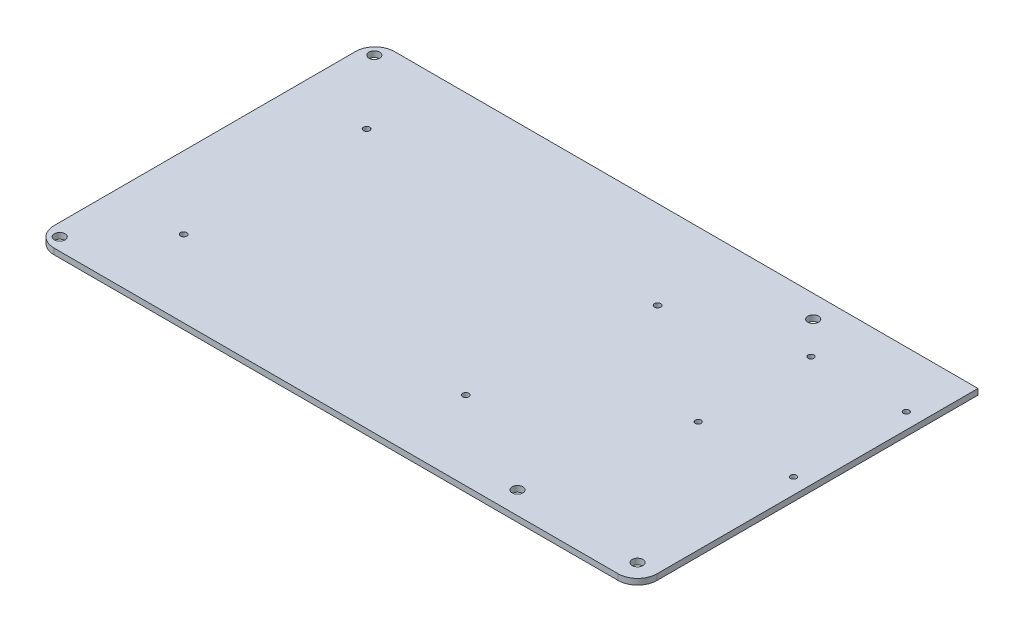
ISO-10303-21;
HEADER;
FILE_DESCRIPTION(('STEP AP214'),'2;1');
FILE_NAME('part.step','',(''),(''),'','','');
FILE_SCHEMA(('AUTOMOTIVE_DESIGN { 1 0 10303 214 1 1 1 1 }'));
ENDSEC;
DATA;
#1=APPLICATION_CONTEXT('core data for automotive mechanical design processes');
#2=APPLICATION_PROTOCOL_DEFINITION('international standard','automotive_design',2000,#1);
#3=PRODUCT_CONTEXT('',#1,'mechanical');
#4=PRODUCT('Part','Part','',(#3));
#5=PRODUCT_RELATED_PRODUCT_CATEGORY('part','',(#4));
#6=PRODUCT_DEFINITION_FORMATION('','',#4);
#7=PRODUCT_DEFINITION_CONTEXT('part definition',#1,'design');
#8=PRODUCT_DEFINITION('design','',#6,#7);
#9=PRODUCT_DEFINITION_SHAPE('','',#8);
#10=(LENGTH_UNIT() NAMED_UNIT(*) SI_UNIT(.MILLI.,.METRE.));
#11=(NAMED_UNIT(*) PLANE_ANGLE_UNIT() SI_UNIT($,.RADIAN.));
#12=(NAMED_UNIT(*) SI_UNIT($,.STERADIAN.) SOLID_ANGLE_UNIT());
#13=UNCERTAINTY_MEASURE_WITH_UNIT(LENGTH_MEASURE(1.E-05),#10,'distance_accuracy_value','');
#14=(GEOMETRIC_REPRESENTATION_CONTEXT(3) GLOBAL_UNCERTAINTY_ASSIGNED_CONTEXT((#13)) GLOBAL_UNIT_ASSIGNED_CONTEXT((#10,
#11,#12)) REPRESENTATION_CONTEXT('',''));
#15=CARTESIAN_POINT('',(0.,0.,0.));
#16=DIRECTION('',(0.,0.,1.));
#17=DIRECTION('',(1.,0.,0.));
#18=AXIS2_PLACEMENT_3D('',#15,#16,#17);
#19=CARTESIAN_POINT('',(145.,3.,77.5));
#20=DIRECTION('',(0.,-1.,0.));
#21=DIRECTION('',(0.,0.,-1.));
#22=AXIS2_PLACEMENT_3D('',#19,#20,#21);
#23=PLANE('',#22);
#24=CARTESIAN_POINT('',(-117.697345367202,3.,-45.8964243223789));
#25=DIRECTION('',(0.,1.,0.));
#26=DIRECTION('',(0.,0.,1.));
#27=AXIS2_PLACEMENT_3D('',#24,#25,#26);
#28=CIRCLE('',#27,1.60000000000001);
#29=CARTESIAN_POINT('',(-117.697345367202,3.,-44.2964243223789));
#30=VERTEX_POINT('',#29);
#31=EDGE_CURVE('E170',#30,#30,#28,.T.);
#32=ORIENTED_EDGE('',*,*,#31,.F.);
#33=EDGE_LOOP('',(#32));
#34=FACE_BOUND('',#33,.T.);
#35=CARTESIAN_POINT('',(35.6685077427976,3.,-42.1419603965456));
#36=DIRECTION('',(0.,1.,0.));
#37=DIRECTION('',(0.,0.,1.));
#38=AXIS2_PLACEMENT_3D('',#35,#36,#37);
#39=CIRCLE('',#38,1.60000000000001);
#40=CARTESIAN_POINT('',(35.6685077427976,3.,-40.5419603965456));
#41=VERTEX_POINT('',#40);
#42=EDGE_CURVE('E328',#41,#41,#39,.T.);
#43=ORIENTED_EDGE('',*,*,#42,.F.);
#44=EDGE_LOOP('',(#43));
#45=FACE_BOUND('',#44,.T.);
#46=CARTESIAN_POINT('',(26.2756564719289,3.,47.1235410340986));
#47=DIRECTION('',(0.,1.,0.));
#48=DIRECTION('',(0.,0.,1.));
#49=AXIS2_PLACEMENT_3D('',#46,#47,#48);
#50=CIRCLE('',#49,1.6);
#51=CARTESIAN_POINT('',(26.2756564719289,3.,48.7235410340985));
#52=VERTEX_POINT('',#51);
#53=EDGE_CURVE('E331',#52,#52,#50,.T.);
#54=ORIENTED_EDGE('',*,*,#53,.F.);
#55=EDGE_LOOP('',(#54));
#56=FACE_BOUND('',#55,.T.);
#57=CARTESIAN_POINT('',(-117.787345368071,3.,48.0535756746172));
#58=DIRECTION('',(0.,1.,0.));
#59=DIRECTION('',(0.,0.,1.));
#60=AXIS2_PLACEMENT_3D('',#57,#58,#59);
#61=CIRCLE('',#60,1.60000000000001);
#62=CARTESIAN_POINT('',(-117.787345368071,3.,49.6535756746172));
#63=VERTEX_POINT('',#62);
#64=EDGE_CURVE('E335',#63,#63,#61,.T.);
#65=ORIENTED_EDGE('',*,*,#64,.F.);
#66=EDGE_LOOP('',(#65));
#67=FACE_BOUND('',#66,.T.);
#68=DIRECTION('',(0.,0.,-1.));
#69=VECTOR('',#68,1.);
#70=CARTESIAN_POINT('',(155.,3.,-87.5000000000001));
#71=LINE('',#70,#69);
#72=CARTESIAN_POINT('',(155.,3.,77.5));
#73=VERTEX_POINT('',#72);
#74=CARTESIAN_POINT('',(155.,3.,-87.5000000000001));
#75=VERTEX_POINT('',#74);
#76=EDGE_CURVE('E156',#73,#75,#71,.T.);
#77=ORIENTED_EDGE('',*,*,#76,.T.);
#78=DIRECTION('',(-1.,0.,0.));
#79=VECTOR('',#78,1.);
#80=CARTESIAN_POINT('',(-145.,3.,-87.5));
#81=LINE('',#80,#79);
#82=CARTESIAN_POINT('',(-145.,3.,-87.5));
#83=VERTEX_POINT('',#82);
#84=EDGE_CURVE('E101',#75,#83,#81,.T.);
#85=ORIENTED_EDGE('',*,*,#84,.T.);
#86=CARTESIAN_POINT('',(-145.,3.,-77.4999999999999));
#87=DIRECTION('',(0.,1.,0.));
#88=DIRECTION('',(0.,0.,-1.));
#89=AXIS2_PLACEMENT_3D('',#86,#87,#88);
#90=CIRCLE('',#89,10.);
#91=CARTESIAN_POINT('',(-155.,3.,-77.4999999999999));
#92=VERTEX_POINT('',#91);
#93=EDGE_CURVE('E240',#83,#92,#90,.T.);
#94=ORIENTED_EDGE('',*,*,#93,.T.);
#95=DIRECTION('',(0.,0.,1.));
#96=VECTOR('',#95,1.);
#97=CARTESIAN_POINT('',(-155.,3.,-77.4999999999999));
#98=LINE('',#97,#96);
#99=CARTESIAN_POINT('',(-155.,3.,77.5));
#100=VERTEX_POINT('',#99);
#101=EDGE_CURVE('E118',#92,#100,#98,.T.);
#102=ORIENTED_EDGE('',*,*,#101,.T.);
#103=CARTESIAN_POINT('',(-145.,3.,77.5));
#104=DIRECTION('',(0.,1.,0.));
#105=DIRECTION('',(0.,0.,1.));
#106=AXIS2_PLACEMENT_3D('',#103,#104,#105);
#107=CIRCLE('',#106,10.);
#108=CARTESIAN_POINT('',(-145.,3.,87.5));
#109=VERTEX_POINT('',#108);
#110=EDGE_CURVE('E112',#100,#109,#107,.T.);
#111=ORIENTED_EDGE('',*,*,#110,.T.);
#112=DIRECTION('',(1.,0.,0.));
#113=VECTOR('',#112,1.);
#114=CARTESIAN_POINT('',(145.,3.,87.5));
#115=LINE('',#114,#113);
#116=CARTESIAN_POINT('',(145.,3.,87.5));
#117=VERTEX_POINT('',#116);
#118=EDGE_CURVE('E116',#109,#117,#115,.T.);
#119=ORIENTED_EDGE('',*,*,#118,.T.);
#120=CARTESIAN_POINT('',(145.,3.,77.5));
#121=DIRECTION('',(0.,1.,0.));
#122=DIRECTION('',(0.,0.,-1.));
#123=AXIS2_PLACEMENT_3D('',#120,#121,#122);
#124=CIRCLE('',#123,10.);
#125=EDGE_CURVE('E59',#117,#73,#124,.T.);
#126=ORIENTED_EDGE('',*,*,#125,.T.);
#127=EDGE_LOOP('',(#77,#85,#94,#102,#111,#119,#126));
#128=FACE_BOUND('',#127,.T.);
#129=CARTESIAN_POINT('',(-148.535533905905,3.,-80.692777162614));
#130=DIRECTION('',(0.,1.,0.));
#131=DIRECTION('',(0.,0.,1.));
#132=AXIS2_PLACEMENT_3D('',#129,#130,#131);
#133=CIRCLE('',#132,2.75000000000001);
#134=CARTESIAN_POINT('',(-148.535533905905,3.,-77.942777162614));
#135=VERTEX_POINT('',#134);
#136=EDGE_CURVE('E145',#135,#135,#133,.T.);
#137=ORIENTED_EDGE('',*,*,#136,.F.);
#138=EDGE_LOOP('',(#137));
#139=FACE_BOUND('',#138,.T.);
#140=CARTESIAN_POINT('',(-148.535533905905,3.,81.0355339059049));
#141=DIRECTION('',(0.,1.,0.));
#142=DIRECTION('',(0.,0.,1.));
#143=AXIS2_PLACEMENT_3D('',#140,#141,#142);
#144=CIRCLE('',#143,2.75000000000001);
#145=CARTESIAN_POINT('',(-148.535533905905,3.,83.7855339059049));
#146=VERTEX_POINT('',#145);
#147=EDGE_CURVE('E226',#146,#146,#144,.T.);
#148=ORIENTED_EDGE('',*,*,#147,.F.);
#149=EDGE_LOOP('',(#148));
#150=FACE_BOUND('',#149,.T.);
#151=CARTESIAN_POINT('',(97.9209453158937,3.,-58.7287511768892));
#152=DIRECTION('',(0.,1.,0.));
#153=DIRECTION('',(0.,0.,1.));
#154=AXIS2_PLACEMENT_3D('',#151,#152,#153);
#155=CIRCLE('',#154,1.5);
#156=CARTESIAN_POINT('',(97.9209453158937,3.,-57.2287511768893));
#157=VERTEX_POINT('',#156);
#158=EDGE_CURVE('E220',#157,#157,#155,.T.);
#159=ORIENTED_EDGE('',*,*,#158,.F.);
#160=EDGE_LOOP('',(#159));
#161=FACE_BOUND('',#160,.T.);
#162=CARTESIAN_POINT('',(146.920945315894,3.,-58.7287511768893));
#163=DIRECTION('',(0.,1.,0.));
#164=DIRECTION('',(0.,0.,1.));
#165=AXIS2_PLACEMENT_3D('',#162,#163,#164);
#166=CIRCLE('',#165,1.5);
#167=CARTESIAN_POINT('',(146.920945315894,3.,-57.2287511768893));
#168=VERTEX_POINT('',#167);
#169=EDGE_CURVE('E214',#168,#168,#166,.T.);
#170=ORIENTED_EDGE('',*,*,#169,.F.);
#171=EDGE_LOOP('',(#170));
#172=FACE_BOUND('',#171,.T.);
#173=CARTESIAN_POINT('',(81.7862434103394,3.,-75.9999999999998));
#174=DIRECTION('',(0.,1.,0.));
#175=DIRECTION('',(0.,0.,1.));
#176=AXIS2_PLACEMENT_3D('',#173,#174,#175);
#177=CIRCLE('',#176,2.75000000000981);
#178=CARTESIAN_POINT('',(81.7862434103394,3.,-73.24999999999));
#179=VERTEX_POINT('',#178);
#180=EDGE_CURVE('E208',#179,#179,#177,.T.);
#181=ORIENTED_EDGE('',*,*,#180,.F.);
#182=EDGE_LOOP('',(#181));
#183=FACE_BOUND('',#182,.T.);
#184=CARTESIAN_POINT('',(97.9209453158937,3.,-0.728751176889254));
#185=DIRECTION('',(0.,1.,0.));
#186=DIRECTION('',(0.,0.,1.));
#187=AXIS2_PLACEMENT_3D('',#184,#185,#186);
#188=CIRCLE('',#187,1.5);
#189=CARTESIAN_POINT('',(97.9209453158937,3.,0.771248823110743));
#190=VERTEX_POINT('',#189);
#191=EDGE_CURVE('E202',#190,#190,#188,.T.);
#192=ORIENTED_EDGE('',*,*,#191,.F.);
#193=EDGE_LOOP('',(#192));
#194=FACE_BOUND('',#193,.T.);
#195=CARTESIAN_POINT('',(146.920945315894,3.,-0.72875117688926));
#196=DIRECTION('',(0.,1.,0.));
#197=DIRECTION('',(0.,0.,1.));
#198=AXIS2_PLACEMENT_3D('',#195,#196,#197);
#199=CIRCLE('',#198,1.5);
#200=CARTESIAN_POINT('',(146.920945315894,3.,0.771248823110737));
#201=VERTEX_POINT('',#200);
#202=EDGE_CURVE('E196',#201,#201,#199,.T.);
#203=ORIENTED_EDGE('',*,*,#202,.F.);
#204=EDGE_LOOP('',(#203));
#205=FACE_BOUND('',#204,.T.);
#206=CARTESIAN_POINT('',(81.7862434103392,3.,76.));
#207=DIRECTION('',(0.,1.,0.));
#208=DIRECTION('',(0.,0.,1.));
#209=AXIS2_PLACEMENT_3D('',#206,#207,#208);
#210=CIRCLE('',#209,2.74999999999605);
#211=CARTESIAN_POINT('',(81.7862434103392,3.,78.7499999999961));
#212=VERTEX_POINT('',#211);
#213=EDGE_CURVE('E190',#212,#212,#210,.T.);
#214=ORIENTED_EDGE('',*,*,#213,.F.);
#215=EDGE_LOOP('',(#214));
#216=FACE_BOUND('',#215,.T.);
#217=CARTESIAN_POINT('',(145.,3.,77.5));
#218=DIRECTION('',(0.,1.,0.));
#219=DIRECTION('',(0.,0.,1.));
#220=AXIS2_PLACEMENT_3D('',#217,#218,#219);
#221=CIRCLE('',#220,2.75000000000001);
#222=CARTESIAN_POINT('',(145.,3.,80.25));
#223=VERTEX_POINT('',#222);
#224=EDGE_CURVE('E181',#223,#223,#221,.T.);
#225=ORIENTED_EDGE('',*,*,#224,.F.);
#226=EDGE_LOOP('',(#225));
#227=FACE_BOUND('',#226,.T.);
#228=ADVANCED_FACE('F40',(#34,#45,#56,#67,#128,#139,#150,#161,#172,#183,#194,#205,#216,#227),
#23,.F.);
#229=CARTESIAN_POINT('',(145.,0.,77.5));
#230=DIRECTION('',(0.,-1.,0.));
#231=DIRECTION('',(0.,0.,-1.));
#232=AXIS2_PLACEMENT_3D('',#229,#230,#231);
#233=PLANE('',#232);
#234=CARTESIAN_POINT('',(-117.697345367202,0.,-45.8964243223789));
#235=DIRECTION('',(0.,-1.,0.));
#236=DIRECTION('',(0.,0.,-1.));
#237=AXIS2_PLACEMENT_3D('',#234,#235,#236);
#238=CIRCLE('',#237,1.60000000000001);
#239=CARTESIAN_POINT('',(-117.697345367202,0.,-47.4964243223789));
#240=VERTEX_POINT('',#239);
#241=EDGE_CURVE('E44',#240,#240,#238,.T.);
#242=ORIENTED_EDGE('',*,*,#241,.F.);
#243=EDGE_LOOP('',(#242));
#244=FACE_BOUND('',#243,.T.);
#245=CARTESIAN_POINT('',(35.6685077427976,0.,-42.1419603965456));
#246=DIRECTION('',(0.,-1.,0.));
#247=DIRECTION('',(0.,0.,-1.));
#248=AXIS2_PLACEMENT_3D('',#245,#246,#247);
#249=CIRCLE('',#248,1.60000000000001);
#250=CARTESIAN_POINT('',(35.6685077427976,0.,-43.7419603965457));
#251=VERTEX_POINT('',#250);
#252=EDGE_CURVE('E172',#251,#251,#249,.T.);
#253=ORIENTED_EDGE('',*,*,#252,.F.);
#254=EDGE_LOOP('',(#253));
#255=FACE_BOUND('',#254,.T.);
#256=CARTESIAN_POINT('',(26.2756564719289,0.,47.1235410340986));
#257=DIRECTION('',(0.,-1.,0.));
#258=DIRECTION('',(0.,0.,-1.));
#259=AXIS2_PLACEMENT_3D('',#256,#257,#258);
#260=CIRCLE('',#259,1.6);
#261=CARTESIAN_POINT('',(26.2756564719289,0.,45.5235410340985));
#262=VERTEX_POINT('',#261);
#263=EDGE_CURVE('E169',#262,#262,#260,.T.);
#264=ORIENTED_EDGE('',*,*,#263,.F.);
#265=EDGE_LOOP('',(#264));
#266=FACE_BOUND('',#265,.T.);
#267=CARTESIAN_POINT('',(-117.787345368071,0.,48.0535756746172));
#268=DIRECTION('',(0.,-1.,0.));
#269=DIRECTION('',(0.,0.,-1.));
#270=AXIS2_PLACEMENT_3D('',#267,#268,#269);
#271=CIRCLE('',#270,1.60000000000001);
#272=CARTESIAN_POINT('',(-117.787345368071,0.,46.4535756746172));
#273=VERTEX_POINT('',#272);
#274=EDGE_CURVE('E166',#273,#273,#271,.T.);
#275=ORIENTED_EDGE('',*,*,#274,.F.);
#276=EDGE_LOOP('',(#275));
#277=FACE_BOUND('',#276,.T.);
#278=CARTESIAN_POINT('',(81.7862434103392,0.,76.));
#279=DIRECTION('',(0.,1.,0.));
#280=DIRECTION('',(0.,0.,1.));
#281=AXIS2_PLACEMENT_3D('',#278,#279,#280);
#282=CIRCLE('',#281,2.74999999999605);
#283=CARTESIAN_POINT('',(81.7862434103392,0.,78.7499999999961));
#284=VERTEX_POINT('',#283);
#285=EDGE_CURVE('E186',#284,#284,#282,.T.);
#286=ORIENTED_EDGE('',*,*,#285,.T.);
#287=EDGE_LOOP('',(#286));
#288=FACE_BOUND('',#287,.T.);
#289=CARTESIAN_POINT('',(97.9209453158937,0.,-0.728751176889254));
#290=DIRECTION('',(0.,1.,0.));
#291=DIRECTION('',(0.,0.,1.));
#292=AXIS2_PLACEMENT_3D('',#289,#290,#291);
#293=CIRCLE('',#292,1.5);
#294=CARTESIAN_POINT('',(97.9209453158937,0.,0.771248823110743));
#295=VERTEX_POINT('',#294);
#296=EDGE_CURVE('E199',#295,#295,#293,.T.);
#297=ORIENTED_EDGE('',*,*,#296,.T.);
#298=EDGE_LOOP('',(#297));
#299=FACE_BOUND('',#298,.T.);
#300=CARTESIAN_POINT('',(146.920945315894,0.,-58.7287511768893));
#301=DIRECTION('',(0.,1.,0.));
#302=DIRECTION('',(0.,0.,1.));
#303=AXIS2_PLACEMENT_3D('',#300,#301,#302);
#304=CIRCLE('',#303,1.5);
#305=CARTESIAN_POINT('',(146.920945315894,0.,-57.2287511768893));
#306=VERTEX_POINT('',#305);
#307=EDGE_CURVE('E211',#306,#306,#304,.T.);
#308=ORIENTED_EDGE('',*,*,#307,.T.);
#309=EDGE_LOOP('',(#308));
#310=FACE_BOUND('',#309,.T.);
#311=CARTESIAN_POINT('',(-148.535533905905,0.,81.0355339059049));
#312=DIRECTION('',(0.,1.,0.));
#313=DIRECTION('',(0.,0.,1.));
#314=AXIS2_PLACEMENT_3D('',#311,#312,#313);
#315=CIRCLE('',#314,2.75000000000001);
#316=CARTESIAN_POINT('',(-148.535533905905,0.,83.7855339059049));
#317=VERTEX_POINT('',#316);
#318=EDGE_CURVE('E223',#317,#317,#315,.T.);
#319=ORIENTED_EDGE('',*,*,#318,.T.);
#320=EDGE_LOOP('',(#319));
#321=FACE_BOUND('',#320,.T.);
#322=DIRECTION('',(0.,0.,-1.));
#323=VECTOR('',#322,1.);
#324=CARTESIAN_POINT('',(155.,0.,-87.5000000000001));
#325=LINE('',#324,#323);
#326=CARTESIAN_POINT('',(155.,0.,77.5));
#327=VERTEX_POINT('',#326);
#328=CARTESIAN_POINT('',(155.,0.,-87.5000000000001));
#329=VERTEX_POINT('',#328);
#330=EDGE_CURVE('E141',#327,#329,#325,.T.);
#331=ORIENTED_EDGE('',*,*,#330,.F.);
#332=CARTESIAN_POINT('',(145.,0.,77.5));
#333=DIRECTION('',(0.,1.,0.));
#334=DIRECTION('',(0.,0.,-1.));
#335=AXIS2_PLACEMENT_3D('',#332,#333,#334);
#336=CIRCLE('',#335,10.);
#337=CARTESIAN_POINT('',(145.,0.,87.5));
#338=VERTEX_POINT('',#337);
#339=EDGE_CURVE('E93',#338,#327,#336,.T.);
#340=ORIENTED_EDGE('',*,*,#339,.F.);
#341=DIRECTION('',(1.,0.,0.));
#342=VECTOR('',#341,1.);
#343=CARTESIAN_POINT('',(145.,0.,87.5));
#344=LINE('',#343,#342);
#345=CARTESIAN_POINT('',(-145.,0.,87.5));
#346=VERTEX_POINT('',#345);
#347=EDGE_CURVE('E87',#346,#338,#344,.T.);
#348=ORIENTED_EDGE('',*,*,#347,.F.);
#349=CARTESIAN_POINT('',(-145.,0.,77.5));
#350=DIRECTION('',(0.,1.,0.));
#351=DIRECTION('',(0.,0.,1.));
#352=AXIS2_PLACEMENT_3D('',#349,#350,#351);
#353=CIRCLE('',#352,10.);
#354=CARTESIAN_POINT('',(-155.,0.,77.5));
#355=VERTEX_POINT('',#354);
#356=EDGE_CURVE('E127',#355,#346,#353,.T.);
#357=ORIENTED_EDGE('',*,*,#356,.F.);
#358=DIRECTION('',(0.,0.,1.));
#359=VECTOR('',#358,1.);
#360=CARTESIAN_POINT('',(-155.,0.,-77.4999999999999));
#361=LINE('',#360,#359);
#362=CARTESIAN_POINT('',(-155.,0.,-77.4999999999999));
#363=VERTEX_POINT('',#362);
#364=EDGE_CURVE('E149',#363,#355,#361,.T.);
#365=ORIENTED_EDGE('',*,*,#364,.F.);
#366=CARTESIAN_POINT('',(-145.,0.,-77.4999999999999));
#367=DIRECTION('',(0.,1.,0.));
#368=DIRECTION('',(0.,0.,-1.));
#369=AXIS2_PLACEMENT_3D('',#366,#367,#368);
#370=CIRCLE('',#369,10.);
#371=CARTESIAN_POINT('',(-145.,0.,-87.5));
#372=VERTEX_POINT('',#371);
#373=EDGE_CURVE('E147',#372,#363,#370,.T.);
#374=ORIENTED_EDGE('',*,*,#373,.F.);
#375=DIRECTION('',(-1.,0.,0.));
#376=VECTOR('',#375,1.);
#377=CARTESIAN_POINT('',(-145.,0.,-87.5));
#378=LINE('',#377,#376);
#379=EDGE_CURVE('E144',#329,#372,#378,.T.);
#380=ORIENTED_EDGE('',*,*,#379,.F.);
#381=EDGE_LOOP('',(#331,#340,#348,#357,#365,#374,#380));
#382=FACE_BOUND('',#381,.T.);
#383=CARTESIAN_POINT('',(-148.535533905905,0.,-80.692777162614));
#384=DIRECTION('',(0.,1.,0.));
#385=DIRECTION('',(0.,0.,1.));
#386=AXIS2_PLACEMENT_3D('',#383,#384,#385);
#387=CIRCLE('',#386,2.75000000000001);
#388=CARTESIAN_POINT('',(-148.535533905905,0.,-77.942777162614));
#389=VERTEX_POINT('',#388);
#390=EDGE_CURVE('E230',#389,#389,#387,.T.);
#391=ORIENTED_EDGE('',*,*,#390,.T.);
#392=EDGE_LOOP('',(#391));
#393=FACE_BOUND('',#392,.T.);
#394=CARTESIAN_POINT('',(97.9209453158937,0.,-58.7287511768892));
#395=DIRECTION('',(0.,1.,0.));
#396=DIRECTION('',(0.,0.,1.));
#397=AXIS2_PLACEMENT_3D('',#394,#395,#396);
#398=CIRCLE('',#397,1.5);
#399=CARTESIAN_POINT('',(97.9209453158937,0.,-57.2287511768893));
#400=VERTEX_POINT('',#399);
#401=EDGE_CURVE('E217',#400,#400,#398,.T.);
#402=ORIENTED_EDGE('',*,*,#401,.T.);
#403=EDGE_LOOP('',(#402));
#404=FACE_BOUND('',#403,.T.);
#405=CARTESIAN_POINT('',(81.7862434103394,0.,-75.9999999999998));
#406=DIRECTION('',(0.,1.,0.));
#407=DIRECTION('',(0.,0.,1.));
#408=AXIS2_PLACEMENT_3D('',#405,#406,#407);
#409=CIRCLE('',#408,2.75000000000981);
#410=CARTESIAN_POINT('',(81.7862434103394,0.,-73.24999999999));
#411=VERTEX_POINT('',#410);
#412=EDGE_CURVE('E205',#411,#411,#409,.T.);
#413=ORIENTED_EDGE('',*,*,#412,.T.);
#414=EDGE_LOOP('',(#413));
#415=FACE_BOUND('',#414,.T.);
#416=CARTESIAN_POINT('',(146.920945315894,0.,-0.72875117688926));
#417=DIRECTION('',(0.,1.,0.));
#418=DIRECTION('',(0.,0.,1.));
#419=AXIS2_PLACEMENT_3D('',#416,#417,#418);
#420=CIRCLE('',#419,1.5);
#421=CARTESIAN_POINT('',(146.920945315894,0.,0.771248823110737));
#422=VERTEX_POINT('',#421);
#423=EDGE_CURVE('E193',#422,#422,#420,.T.);
#424=ORIENTED_EDGE('',*,*,#423,.T.);
#425=EDGE_LOOP('',(#424));
#426=FACE_BOUND('',#425,.T.);
#427=CARTESIAN_POINT('',(145.,0.,77.5));
#428=DIRECTION('',(0.,1.,0.));
#429=DIRECTION('',(0.,0.,1.));
#430=AXIS2_PLACEMENT_3D('',#427,#428,#429);
#431=CIRCLE('',#430,2.75000000000001);
#432=CARTESIAN_POINT('',(145.,0.,80.25));
#433=VERTEX_POINT('',#432);
#434=EDGE_CURVE('E177',#433,#433,#431,.T.);
#435=ORIENTED_EDGE('',*,*,#434,.T.);
#436=EDGE_LOOP('',(#435));
#437=FACE_BOUND('',#436,.T.);
#438=ADVANCED_FACE('F252',(#244,#255,#266,#277,#288,#299,#310,#321,#382,#393,#404,#415,#426,
#437),#233,.T.);
#439=CARTESIAN_POINT('',(155.,3.,-87.5000000000001));
#440=DIRECTION('',(-1.,0.,0.));
#441=DIRECTION('',(0.,0.,1.));
#442=AXIS2_PLACEMENT_3D('',#439,#440,#441);
#443=PLANE('',#442);
#444=ORIENTED_EDGE('',*,*,#330,.T.);
#445=DIRECTION('',(0.,-1.,0.));
#446=VECTOR('',#445,1.);
#447=CARTESIAN_POINT('',(155.,3.,-87.5000000000001));
#448=LINE('',#447,#446);
#449=EDGE_CURVE('E11',#75,#329,#448,.T.);
#450=ORIENTED_EDGE('',*,*,#449,.F.);
#451=ORIENTED_EDGE('',*,*,#76,.F.);
#452=DIRECTION('',(0.,-1.,0.));
#453=VECTOR('',#452,1.);
#454=CARTESIAN_POINT('',(155.,3.,77.5));
#455=LINE('',#454,#453);
#456=EDGE_CURVE('E137',#73,#327,#455,.T.);
#457=ORIENTED_EDGE('',*,*,#456,.T.);
#458=EDGE_LOOP('',(#444,#450,#451,#457));
#459=FACE_BOUND('',#458,.T.);
#460=ADVANCED_FACE('F42',(#459),#443,.F.);
#461=CARTESIAN_POINT('',(-145.,3.,-87.5));
#462=DIRECTION('',(0.,0.,1.));
#463=DIRECTION('',(1.,0.,0.));
#464=AXIS2_PLACEMENT_3D('',#461,#462,#463);
#465=PLANE('',#464);
#466=ORIENTED_EDGE('',*,*,#379,.T.);
#467=DIRECTION('',(0.,-1.,0.));
#468=VECTOR('',#467,1.);
#469=CARTESIAN_POINT('',(-145.,3.,-87.5));
#470=LINE('',#469,#468);
#471=EDGE_CURVE('E50',#83,#372,#470,.T.);
#472=ORIENTED_EDGE('',*,*,#471,.F.);
#473=ORIENTED_EDGE('',*,*,#84,.F.);
#474=ORIENTED_EDGE('',*,*,#449,.T.);
#475=EDGE_LOOP('',(#466,#472,#473,#474));
#476=FACE_BOUND('',#475,.T.);
#477=ADVANCED_FACE('F431',(#476),#465,.F.);
#478=CARTESIAN_POINT('',(-145.,3.,-77.4999999999999));
#479=DIRECTION('',(0.,-1.,0.));
#480=DIRECTION('',(0.,0.,-1.));
#481=AXIS2_PLACEMENT_3D('',#478,#479,#480);
#482=CYLINDRICAL_SURFACE('',#481,10.);
#483=ORIENTED_EDGE('',*,*,#373,.T.);
#484=DIRECTION('',(0.,-1.,0.));
#485=VECTOR('',#484,1.);
#486=CARTESIAN_POINT('',(-155.,3.,-77.4999999999999));
#487=LINE('',#486,#485);
#488=EDGE_CURVE('E161',#92,#363,#487,.T.);
#489=ORIENTED_EDGE('',*,*,#488,.F.);
#490=ORIENTED_EDGE('',*,*,#93,.F.);
#491=ORIENTED_EDGE('',*,*,#471,.T.);
#492=EDGE_LOOP('',(#483,#489,#490,#491));
#493=FACE_BOUND('',#492,.T.);
#494=ADVANCED_FACE('F245',(#493),#482,.T.);
#495=CARTESIAN_POINT('',(-155.,3.,-77.4999999999999));
#496=DIRECTION('',(1.,0.,0.));
#497=DIRECTION('',(0.,0.,-1.));
#498=AXIS2_PLACEMENT_3D('',#495,#496,#497);
#499=PLANE('',#498);
#500=ORIENTED_EDGE('',*,*,#364,.T.);
#501=DIRECTION('',(0.,-1.,0.));
#502=VECTOR('',#501,1.);
#503=CARTESIAN_POINT('',(-155.,3.,77.5));
#504=LINE('',#503,#502);
#505=EDGE_CURVE('E129',#100,#355,#504,.T.);
#506=ORIENTED_EDGE('',*,*,#505,.F.);
#507=ORIENTED_EDGE('',*,*,#101,.F.);
#508=ORIENTED_EDGE('',*,*,#488,.T.);
#509=EDGE_LOOP('',(#500,#506,#507,#508));
#510=FACE_BOUND('',#509,.T.);
#511=ADVANCED_FACE('F249',(#510),#499,.F.);
#512=CARTESIAN_POINT('',(-145.,3.,77.5));
#513=DIRECTION('',(0.,-1.,0.));
#514=DIRECTION('',(0.,0.,-1.));
#515=AXIS2_PLACEMENT_3D('',#512,#513,#514);
#516=CYLINDRICAL_SURFACE('',#515,10.);
#517=ORIENTED_EDGE('',*,*,#356,.T.);
#518=DIRECTION('',(0.,-1.,0.));
#519=VECTOR('',#518,1.);
#520=CARTESIAN_POINT('',(-145.,3.,87.5));
#521=LINE('',#520,#519);
#522=EDGE_CURVE('E124',#109,#346,#521,.T.);
#523=ORIENTED_EDGE('',*,*,#522,.F.);
#524=ORIENTED_EDGE('',*,*,#110,.F.);
#525=ORIENTED_EDGE('',*,*,#505,.T.);
#526=EDGE_LOOP('',(#517,#523,#524,#525));
#527=FACE_BOUND('',#526,.T.);
#528=ADVANCED_FACE('F125',(#527),#516,.T.);
#529=CARTESIAN_POINT('',(145.,3.,87.5));
#530=DIRECTION('',(0.,0.,-1.));
#531=DIRECTION('',(-1.,0.,0.));
#532=AXIS2_PLACEMENT_3D('',#529,#530,#531);
#533=PLANE('',#532);
#534=ORIENTED_EDGE('',*,*,#347,.T.);
#535=DIRECTION('',(0.,-1.,0.));
#536=VECTOR('',#535,1.);
#537=CARTESIAN_POINT('',(145.,3.,87.5));
#538=LINE('',#537,#536);
#539=EDGE_CURVE('E130',#117,#338,#538,.T.);
#540=ORIENTED_EDGE('',*,*,#539,.F.);
#541=ORIENTED_EDGE('',*,*,#118,.F.);
#542=ORIENTED_EDGE('',*,*,#522,.T.);
#543=EDGE_LOOP('',(#534,#540,#541,#542));
#544=FACE_BOUND('',#543,.T.);
#545=ADVANCED_FACE('F132',(#544),#533,.F.);
#546=CARTESIAN_POINT('',(145.,3.,77.5));
#547=DIRECTION('',(0.,-1.,0.));
#548=DIRECTION('',(0.,0.,-1.));
#549=AXIS2_PLACEMENT_3D('',#546,#547,#548);
#550=CYLINDRICAL_SURFACE('',#549,10.);
#551=ORIENTED_EDGE('',*,*,#339,.T.);
#552=ORIENTED_EDGE('',*,*,#456,.F.);
#553=ORIENTED_EDGE('',*,*,#125,.F.);
#554=ORIENTED_EDGE('',*,*,#539,.T.);
#555=EDGE_LOOP('',(#551,#552,#553,#554));
#556=FACE_BOUND('',#555,.T.);
#557=ADVANCED_FACE('F257',(#556),#550,.T.);
#558=CARTESIAN_POINT('',(-148.535533905905,3.,-80.692777162614));
#559=DIRECTION('',(0.,-1.,0.));
#560=DIRECTION('',(0.,0.,-1.));
#561=AXIS2_PLACEMENT_3D('',#558,#559,#560);
#562=CYLINDRICAL_SURFACE('',#561,2.75000000000001);
#563=ORIENTED_EDGE('',*,*,#136,.T.);
#564=EDGE_LOOP('',(#563));
#565=FACE_BOUND('',#564,.T.);
#566=ORIENTED_EDGE('',*,*,#390,.F.);
#567=EDGE_LOOP('',(#566));
#568=FACE_BOUND('',#567,.T.);
#569=ADVANCED_FACE('F259',(#565,#568),#562,.F.);
#570=CARTESIAN_POINT('',(-148.535533905905,3.,81.0355339059049));
#571=DIRECTION('',(0.,-1.,0.));
#572=DIRECTION('',(0.,0.,-1.));
#573=AXIS2_PLACEMENT_3D('',#570,#571,#572);
#574=CYLINDRICAL_SURFACE('',#573,2.75000000000001);
#575=ORIENTED_EDGE('',*,*,#147,.T.);
#576=EDGE_LOOP('',(#575));
#577=FACE_BOUND('',#576,.T.);
#578=ORIENTED_EDGE('',*,*,#318,.F.);
#579=EDGE_LOOP('',(#578));
#580=FACE_BOUND('',#579,.T.);
#581=ADVANCED_FACE('F265',(#577,#580),#574,.F.);
#582=CARTESIAN_POINT('',(97.9209453158937,3.,-58.7287511768892));
#583=DIRECTION('',(0.,-1.,0.));
#584=DIRECTION('',(0.,0.,-1.));
#585=AXIS2_PLACEMENT_3D('',#582,#583,#584);
#586=CYLINDRICAL_SURFACE('',#585,1.5);
#587=ORIENTED_EDGE('',*,*,#158,.T.);
#588=EDGE_LOOP('',(#587));
#589=FACE_BOUND('',#588,.T.);
#590=ORIENTED_EDGE('',*,*,#401,.F.);
#591=EDGE_LOOP('',(#590));
#592=FACE_BOUND('',#591,.T.);
#593=ADVANCED_FACE('F282',(#589,#592),#586,.F.);
#594=CARTESIAN_POINT('',(146.920945315894,3.,-58.7287511768893));
#595=DIRECTION('',(0.,-1.,0.));
#596=DIRECTION('',(0.,0.,-1.));
#597=AXIS2_PLACEMENT_3D('',#594,#595,#596);
#598=CYLINDRICAL_SURFACE('',#597,1.5);
#599=ORIENTED_EDGE('',*,*,#169,.T.);
#600=EDGE_LOOP('',(#599));
#601=FACE_BOUND('',#600,.T.);
#602=ORIENTED_EDGE('',*,*,#307,.F.);
#603=EDGE_LOOP('',(#602));
#604=FACE_BOUND('',#603,.T.);
#605=ADVANCED_FACE('F286',(#601,#604),#598,.F.);
#606=CARTESIAN_POINT('',(81.7862434103394,3.,-75.9999999999998));
#607=DIRECTION('',(0.,-1.,0.));
#608=DIRECTION('',(0.,0.,-1.));
#609=AXIS2_PLACEMENT_3D('',#606,#607,#608);
#610=CYLINDRICAL_SURFACE('',#609,2.75000000000981);
#611=ORIENTED_EDGE('',*,*,#180,.T.);
#612=EDGE_LOOP('',(#611));
#613=FACE_BOUND('',#612,.T.);
#614=ORIENTED_EDGE('',*,*,#412,.F.);
#615=EDGE_LOOP('',(#614));
#616=FACE_BOUND('',#615,.T.);
#617=ADVANCED_FACE('F290',(#613,#616),#610,.F.);
#618=CARTESIAN_POINT('',(97.9209453158937,3.,-0.728751176889254));
#619=DIRECTION('',(0.,-1.,0.));
#620=DIRECTION('',(0.,0.,-1.));
#621=AXIS2_PLACEMENT_3D('',#618,#619,#620);
#622=CYLINDRICAL_SURFACE('',#621,1.5);
#623=ORIENTED_EDGE('',*,*,#191,.T.);
#624=EDGE_LOOP('',(#623));
#625=FACE_BOUND('',#624,.T.);
#626=ORIENTED_EDGE('',*,*,#296,.F.);
#627=EDGE_LOOP('',(#626));
#628=FACE_BOUND('',#627,.T.);
#629=ADVANCED_FACE('F294',(#625,#628),#622,.F.);
#630=CARTESIAN_POINT('',(146.920945315894,3.,-0.72875117688926));
#631=DIRECTION('',(0.,-1.,0.));
#632=DIRECTION('',(0.,0.,-1.));
#633=AXIS2_PLACEMENT_3D('',#630,#631,#632);
#634=CYLINDRICAL_SURFACE('',#633,1.5);
#635=ORIENTED_EDGE('',*,*,#202,.T.);
#636=EDGE_LOOP('',(#635));
#637=FACE_BOUND('',#636,.T.);
#638=ORIENTED_EDGE('',*,*,#423,.F.);
#639=EDGE_LOOP('',(#638));
#640=FACE_BOUND('',#639,.T.);
#641=ADVANCED_FACE('F298',(#637,#640),#634,.F.);
#642=CARTESIAN_POINT('',(81.7862434103392,3.,76.));
#643=DIRECTION('',(0.,-1.,0.));
#644=DIRECTION('',(0.,0.,-1.));
#645=AXIS2_PLACEMENT_3D('',#642,#643,#644);
#646=CYLINDRICAL_SURFACE('',#645,2.74999999999605);
#647=ORIENTED_EDGE('',*,*,#213,.T.);
#648=EDGE_LOOP('',(#647));
#649=FACE_BOUND('',#648,.T.);
#650=ORIENTED_EDGE('',*,*,#285,.F.);
#651=EDGE_LOOP('',(#650));
#652=FACE_BOUND('',#651,.T.);
#653=ADVANCED_FACE('F302',(#649,#652),#646,.F.);
#654=CARTESIAN_POINT('',(145.,3.,77.5));
#655=DIRECTION('',(0.,-1.,0.));
#656=DIRECTION('',(0.,0.,-1.));
#657=AXIS2_PLACEMENT_3D('',#654,#655,#656);
#658=CYLINDRICAL_SURFACE('',#657,2.75000000000001);
#659=ORIENTED_EDGE('',*,*,#224,.T.);
#660=EDGE_LOOP('',(#659));
#661=FACE_BOUND('',#660,.T.);
#662=ORIENTED_EDGE('',*,*,#434,.F.);
#663=EDGE_LOOP('',(#662));
#664=FACE_BOUND('',#663,.T.);
#665=ADVANCED_FACE('F306',(#661,#664),#658,.F.);
#666=CARTESIAN_POINT('',(-117.787345368071,-7.,48.0535756746172));
#667=DIRECTION('',(0.,1.,0.));
#668=DIRECTION('',(0.,0.,1.));
#669=AXIS2_PLACEMENT_3D('',#666,#667,#668);
#670=CYLINDRICAL_SURFACE('',#669,1.60000000000001);
#671=ORIENTED_EDGE('',*,*,#274,.T.);
#672=EDGE_LOOP('',(#671));
#673=FACE_BOUND('',#672,.T.);
#674=ORIENTED_EDGE('',*,*,#64,.T.);
#675=EDGE_LOOP('',(#674));
#676=FACE_BOUND('',#675,.T.);
#677=ADVANCED_FACE('F310',(#673,#676),#670,.F.);
#678=CARTESIAN_POINT('',(26.2756564719289,-7.,47.1235410340986));
#679=DIRECTION('',(0.,1.,0.));
#680=DIRECTION('',(0.,0.,1.));
#681=AXIS2_PLACEMENT_3D('',#678,#679,#680);
#682=CYLINDRICAL_SURFACE('',#681,1.6);
#683=ORIENTED_EDGE('',*,*,#263,.T.);
#684=EDGE_LOOP('',(#683));
#685=FACE_BOUND('',#684,.T.);
#686=ORIENTED_EDGE('',*,*,#53,.T.);
#687=EDGE_LOOP('',(#686));
#688=FACE_BOUND('',#687,.T.);
#689=ADVANCED_FACE('F314',(#685,#688),#682,.F.);
#690=CARTESIAN_POINT('',(35.6685077427976,-7.,-42.1419603965456));
#691=DIRECTION('',(0.,1.,0.));
#692=DIRECTION('',(0.,0.,1.));
#693=AXIS2_PLACEMENT_3D('',#690,#691,#692);
#694=CYLINDRICAL_SURFACE('',#693,1.60000000000001);
#695=ORIENTED_EDGE('',*,*,#252,.T.);
#696=EDGE_LOOP('',(#695));
#697=FACE_BOUND('',#696,.T.);
#698=ORIENTED_EDGE('',*,*,#42,.T.);
#699=EDGE_LOOP('',(#698));
#700=FACE_BOUND('',#699,.T.);
#701=ADVANCED_FACE('F318',(#697,#700),#694,.F.);
#702=CARTESIAN_POINT('',(-117.697345367202,-7.,-45.8964243223789));
#703=DIRECTION('',(0.,1.,0.));
#704=DIRECTION('',(0.,0.,1.));
#705=AXIS2_PLACEMENT_3D('',#702,#703,#704);
#706=CYLINDRICAL_SURFACE('',#705,1.60000000000001);
#707=ORIENTED_EDGE('',*,*,#241,.T.);
#708=EDGE_LOOP('',(#707));
#709=FACE_BOUND('',#708,.T.);
#710=ORIENTED_EDGE('',*,*,#31,.T.);
#711=EDGE_LOOP('',(#710));
#712=FACE_BOUND('',#711,.T.);
#713=ADVANCED_FACE('F322',(#709,#712),#706,.F.);
#714=CLOSED_SHELL('',(#228,#438,#460,#477,#494,#511,#528,#545,#557,#569,#581,#593,#605,#617,
#629,#641,#653,#665,#677,#689,#701,#713));
#715=MANIFOLD_SOLID_BREP('B2',#714);
#716=ADVANCED_BREP_SHAPE_REPRESENTATION('',(#18,#715),#14);
#717=SHAPE_DEFINITION_REPRESENTATION(#9,#716);
ENDSEC;
END-ISO-10303-21;
